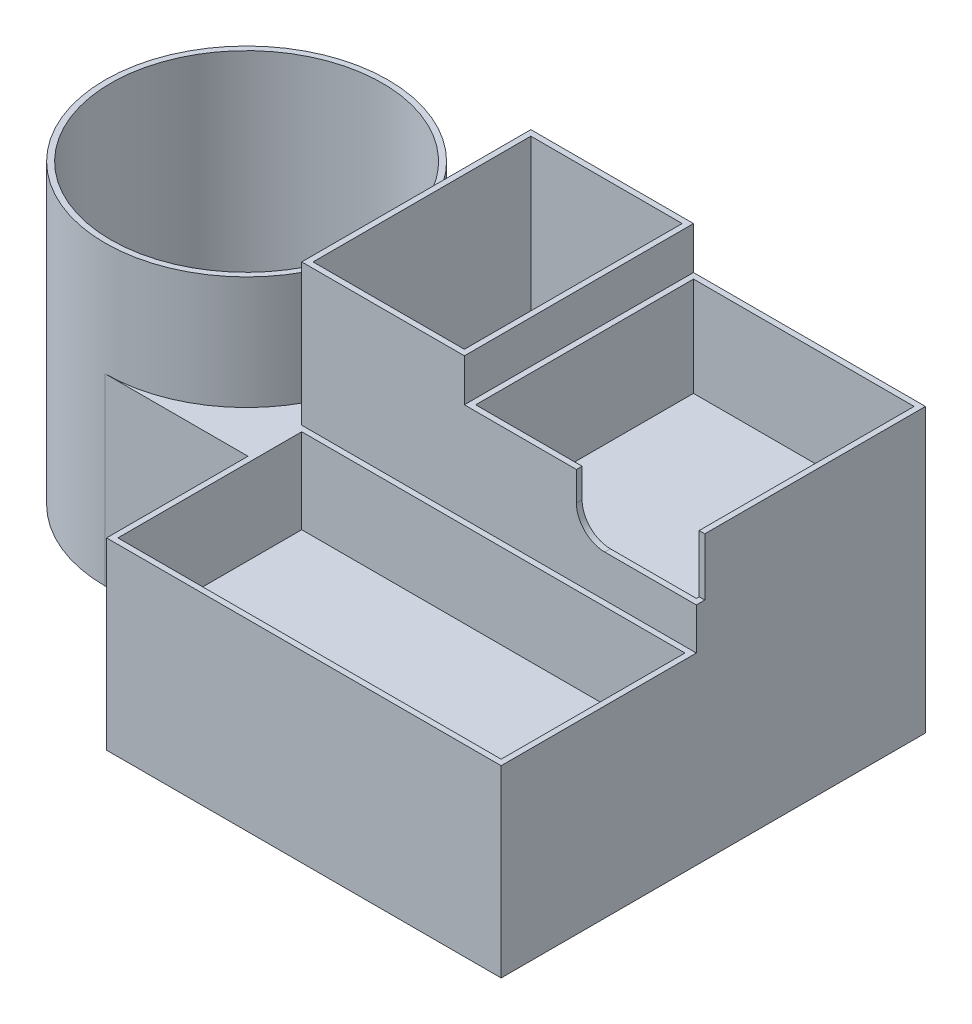
ISO-10303-21;
HEADER;
FILE_DESCRIPTION(('STEP AP214'),'2;1');
FILE_NAME('part.step','',(''),(''),'','','');
FILE_SCHEMA(('AUTOMOTIVE_DESIGN { 1 0 10303 214 1 1 1 1 }'));
ENDSEC;
DATA;
#1=APPLICATION_CONTEXT('core data for automotive mechanical design processes');
#2=APPLICATION_PROTOCOL_DEFINITION('international standard','automotive_design',2000,#1);
#3=PRODUCT_CONTEXT('',#1,'mechanical');
#4=PRODUCT('Part','Part','',(#3));
#5=PRODUCT_RELATED_PRODUCT_CATEGORY('part','',(#4));
#6=PRODUCT_DEFINITION_FORMATION('','',#4);
#7=PRODUCT_DEFINITION_CONTEXT('part definition',#1,'design');
#8=PRODUCT_DEFINITION('design','',#6,#7);
#9=PRODUCT_DEFINITION_SHAPE('','',#8);
#10=(LENGTH_UNIT() NAMED_UNIT(*) SI_UNIT(.MILLI.,.METRE.));
#11=(NAMED_UNIT(*) PLANE_ANGLE_UNIT() SI_UNIT($,.RADIAN.));
#12=(NAMED_UNIT(*) SI_UNIT($,.STERADIAN.) SOLID_ANGLE_UNIT());
#13=UNCERTAINTY_MEASURE_WITH_UNIT(LENGTH_MEASURE(1.E-05),#10,'distance_accuracy_value','');
#14=(GEOMETRIC_REPRESENTATION_CONTEXT(3) GLOBAL_UNCERTAINTY_ASSIGNED_CONTEXT((#13)) GLOBAL_UNIT_ASSIGNED_CONTEXT((#10,
#11,#12)) REPRESENTATION_CONTEXT('',''));
#15=CARTESIAN_POINT('',(0.,0.,0.));
#16=DIRECTION('',(0.,0.,1.));
#17=DIRECTION('',(1.,0.,0.));
#18=AXIS2_PLACEMENT_3D('',#15,#16,#17);
#19=CARTESIAN_POINT('',(-71.,65.,-1.));
#20=DIRECTION('',(0.,1.,0.));
#21=DIRECTION('',(0.,0.,1.));
#22=AXIS2_PLACEMENT_3D('',#19,#20,#21);
#23=PLANE('',#22);
#24=DIRECTION('',(0.,0.,1.));
#25=VECTOR('',#24,1.);
#26=CARTESIAN_POINT('',(-17.5,65.,98.));
#27=LINE('',#26,#25);
#28=CARTESIAN_POINT('',(-17.5,65.,33.));
#29=VERTEX_POINT('',#28);
#30=CARTESIAN_POINT('',(-17.5,65.,98.));
#31=VERTEX_POINT('',#30);
#32=EDGE_CURVE('E53',#29,#31,#27,.T.);
#33=ORIENTED_EDGE('',*,*,#32,.F.);
#34=DIRECTION('',(-1.,0.,0.));
#35=VECTOR('',#34,1.);
#36=CARTESIAN_POINT('',(-17.5,65.,33.));
#37=LINE('',#36,#35);
#38=CARTESIAN_POINT('',(118.,65.,33.));
#39=VERTEX_POINT('',#38);
#40=EDGE_CURVE('E258',#39,#29,#37,.T.);
#41=ORIENTED_EDGE('',*,*,#40,.F.);
#42=DIRECTION('',(0.,0.,-1.));
#43=VECTOR('',#42,1.);
#44=CARTESIAN_POINT('',(118.,65.,98.));
#45=LINE('',#44,#43);
#46=CARTESIAN_POINT('',(118.,65.,98.));
#47=VERTEX_POINT('',#46);
#48=EDGE_CURVE('E261',#47,#39,#45,.T.);
#49=ORIENTED_EDGE('',*,*,#48,.F.);
#50=DIRECTION('',(1.,0.,0.));
#51=VECTOR('',#50,1.);
#52=CARTESIAN_POINT('',(-17.5,65.,98.));
#53=LINE('',#52,#51);
#54=EDGE_CURVE('E267',#31,#47,#53,.T.);
#55=ORIENTED_EDGE('',*,*,#54,.F.);
#56=EDGE_LOOP('',(#33,#41,#49,#55));
#57=FACE_BOUND('',#56,.T.);
#58=DIRECTION('',(1.,0.,0.));
#59=VECTOR('',#58,1.);
#60=CARTESIAN_POINT('',(-69.9999999999997,65.,50.));
#61=LINE('',#60,#59);
#62=CARTESIAN_POINT('',(-69.9999999999997,65.,50.));
#63=VERTEX_POINT('',#62);
#64=CARTESIAN_POINT('',(-19.5,65.,50.));
#65=VERTEX_POINT('',#64);
#66=EDGE_CURVE('E445',#63,#65,#61,.T.);
#67=ORIENTED_EDGE('',*,*,#66,.T.);
#68=DIRECTION('',(0.,0.,1.));
#69=VECTOR('',#68,1.);
#70=CARTESIAN_POINT('',(-19.5,65.,50.));
#71=LINE('',#70,#69);
#72=CARTESIAN_POINT('',(-19.5,65.,100.));
#73=VERTEX_POINT('',#72);
#74=EDGE_CURVE('E273',#65,#73,#71,.T.);
#75=ORIENTED_EDGE('',*,*,#74,.T.);
#76=DIRECTION('',(1.,0.,0.));
#77=VECTOR('',#76,1.);
#78=CARTESIAN_POINT('',(-19.5,65.,100.));
#79=LINE('',#78,#77);
#80=CARTESIAN_POINT('',(120.,65.,100.));
#81=VERTEX_POINT('',#80);
#82=EDGE_CURVE('E279',#73,#81,#79,.T.);
#83=ORIENTED_EDGE('',*,*,#82,.T.);
#84=DIRECTION('',(0.,0.,-1.));
#85=VECTOR('',#84,1.);
#86=CARTESIAN_POINT('',(120.,65.,50.));
#87=LINE('',#86,#85);
#88=CARTESIAN_POINT('',(120.,65.,31.));
#89=VERTEX_POINT('',#88);
#90=EDGE_CURVE('E434',#81,#89,#87,.T.);
#91=ORIENTED_EDGE('',*,*,#90,.T.);
#92=DIRECTION('',(1.,0.,0.));
#93=VECTOR('',#92,1.);
#94=CARTESIAN_POINT('',(-71.,65.,31.));
#95=LINE('',#94,#93);
#96=CARTESIAN_POINT('',(-19.5,65.,31.));
#97=VERTEX_POINT('',#96);
#98=EDGE_CURVE('E475',#97,#89,#95,.T.);
#99=ORIENTED_EDGE('',*,*,#98,.F.);
#100=DIRECTION('',(0.,0.,-1.));
#101=VECTOR('',#100,1.);
#102=CARTESIAN_POINT('',(-19.5,65.,-1.00000000000001));
#103=LINE('',#102,#101);
#104=CARTESIAN_POINT('',(-19.5,65.,-50.));
#105=VERTEX_POINT('',#104);
#106=EDGE_CURVE('E478',#97,#105,#103,.T.);
#107=ORIENTED_EDGE('',*,*,#106,.T.);
#108=DIRECTION('',(-1.,0.,0.));
#109=VECTOR('',#108,1.);
#110=CARTESIAN_POINT('',(-70.9999999999997,65.,-50.));
#111=LINE('',#110,#109);
#112=CARTESIAN_POINT('',(-70.,65.,-50.));
#113=VERTEX_POINT('',#112);
#114=EDGE_CURVE('E438',#105,#113,#111,.T.);
#115=ORIENTED_EDGE('',*,*,#114,.T.);
#116=CARTESIAN_POINT('',(-70.,65.,0.));
#117=DIRECTION('',(0.,1.,0.));
#118=DIRECTION('',(0.,0.,1.));
#119=AXIS2_PLACEMENT_3D('',#116,#117,#118);
#120=CIRCLE('',#119,50.);
#121=EDGE_CURVE('E472',#113,#63,#120,.F.);
#122=ORIENTED_EDGE('',*,*,#121,.T.);
#123=EDGE_LOOP('',(#67,#75,#83,#91,#99,#107,#115,#122));
#124=FACE_BOUND('',#123,.T.);
#125=ADVANCED_FACE('F38',(#57,#124),#23,.T.);
#126=DIRECTION('',(0.,0.,1.));
#127=VECTOR('',#126,1.);
#128=CARTESIAN_POINT('',(-120.,65.,-3.53883589099269E-13));
#129=LINE('',#128,#127);
#130=CARTESIAN_POINT('',(-120.,65.,-0.999999999999662));
#131=VERTEX_POINT('',#130);
#132=CARTESIAN_POINT('',(-120.,65.,0.));
#133=VERTEX_POINT('',#132);
#134=EDGE_CURVE('E442',#131,#133,#129,.T.);
#135=ORIENTED_EDGE('',*,*,#134,.T.);
#136=EDGE_CURVE('E474',#133,#113,#120,.F.);
#137=ORIENTED_EDGE('',*,*,#136,.T.);
#138=CARTESIAN_POINT('',(-70.9999999999997,65.,-50.));
#139=VERTEX_POINT('',#138);
#140=EDGE_CURVE('E436',#113,#139,#111,.T.);
#141=ORIENTED_EDGE('',*,*,#140,.T.);
#142=CARTESIAN_POINT('',(-71.,65.,-1.));
#143=DIRECTION('',(0.,1.,0.));
#144=DIRECTION('',(0.,0.,1.));
#145=AXIS2_PLACEMENT_3D('',#142,#143,#144);
#146=CIRCLE('',#145,49.);
#147=EDGE_CURVE('E440',#139,#131,#146,.T.);
#148=ORIENTED_EDGE('',*,*,#147,.T.);
#149=EDGE_LOOP('',(#135,#137,#141,#148));
#150=FACE_BOUND('',#149,.T.);
#151=ADVANCED_FACE('F564',(#150),#23,.T.);
#152=CARTESIAN_POINT('',(120.,65.,50.));
#153=DIRECTION('',(-1.,0.,0.));
#154=DIRECTION('',(0.,0.,1.));
#155=AXIS2_PLACEMENT_3D('',#152,#153,#154);
#156=PLANE('',#155);
#157=DIRECTION('',(0.,0.,-1.));
#158=VECTOR('',#157,1.);
#159=CARTESIAN_POINT('',(120.,0.,50.));
#160=LINE('',#159,#158);
#161=CARTESIAN_POINT('',(120.,0.,100.));
#162=VERTEX_POINT('',#161);
#163=CARTESIAN_POINT('',(120.,0.,-50.));
#164=VERTEX_POINT('',#163);
#165=EDGE_CURVE('E433',#162,#164,#160,.T.);
#166=ORIENTED_EDGE('',*,*,#165,.T.);
#167=DIRECTION('',(0.,-1.,0.));
#168=VECTOR('',#167,1.);
#169=CARTESIAN_POINT('',(120.,65.,-50.));
#170=LINE('',#169,#168);
#171=CARTESIAN_POINT('',(120.,100.,-50.));
#172=VERTEX_POINT('',#171);
#173=EDGE_CURVE('E469',#172,#164,#170,.T.);
#174=ORIENTED_EDGE('',*,*,#173,.F.);
#175=DIRECTION('',(0.,0.,-1.));
#176=VECTOR('',#175,1.);
#177=CARTESIAN_POINT('',(120.,100.,0.));
#178=LINE('',#177,#176);
#179=CARTESIAN_POINT('',(120.,100.,28.));
#180=VERTEX_POINT('',#179);
#181=EDGE_CURVE('E333',#180,#172,#178,.T.);
#182=ORIENTED_EDGE('',*,*,#181,.F.);
#183=DIRECTION('',(0.,1.,0.));
#184=VECTOR('',#183,1.);
#185=CARTESIAN_POINT('',(120.,100.,28.));
#186=LINE('',#185,#184);
#187=CARTESIAN_POINT('',(120.,79.725450473205,28.));
#188=VERTEX_POINT('',#187);
#189=EDGE_CURVE('E300',#188,#180,#186,.T.);
#190=ORIENTED_EDGE('',*,*,#189,.F.);
#191=DIRECTION('',(0.,0.,1.));
#192=VECTOR('',#191,1.);
#193=CARTESIAN_POINT('',(120.,79.725450473205,28.));
#194=LINE('',#193,#192);
#195=CARTESIAN_POINT('',(120.,79.725450473205,31.));
#196=VERTEX_POINT('',#195);
#197=EDGE_CURVE('E309',#188,#196,#194,.T.);
#198=ORIENTED_EDGE('',*,*,#197,.T.);
#199=DIRECTION('',(0.,-1.,0.));
#200=VECTOR('',#199,1.);
#201=CARTESIAN_POINT('',(120.,100.,31.));
#202=LINE('',#201,#200);
#203=EDGE_CURVE('E347',#196,#89,#202,.T.);
#204=ORIENTED_EDGE('',*,*,#203,.T.);
#205=ORIENTED_EDGE('',*,*,#90,.F.);
#206=DIRECTION('',(0.,1.,0.));
#207=VECTOR('',#206,1.);
#208=CARTESIAN_POINT('',(120.,0.,100.));
#209=LINE('',#208,#207);
#210=EDGE_CURVE('E288',#162,#81,#209,.T.);
#211=ORIENTED_EDGE('',*,*,#210,.F.);
#212=EDGE_LOOP('',(#166,#174,#182,#190,#198,#204,#205,#211));
#213=FACE_BOUND('',#212,.T.);
#214=ADVANCED_FACE('F40',(#213),#156,.F.);
#215=CARTESIAN_POINT('',(-70.9999999999997,65.,-50.));
#216=DIRECTION('',(0.,0.,1.));
#217=DIRECTION('',(1.,0.,0.));
#218=AXIS2_PLACEMENT_3D('',#215,#216,#217);
#219=PLANE('',#218);
#220=ORIENTED_EDGE('',*,*,#114,.F.);
#221=DIRECTION('',(0.,-1.,0.));
#222=VECTOR('',#221,1.);
#223=CARTESIAN_POINT('',(-19.5,115.,-50.));
#224=LINE('',#223,#222);
#225=CARTESIAN_POINT('',(-19.5,115.,-50.));
#226=VERTEX_POINT('',#225);
#227=EDGE_CURVE('E408',#226,#105,#224,.T.);
#228=ORIENTED_EDGE('',*,*,#227,.F.);
#229=DIRECTION('',(-1.,0.,0.));
#230=VECTOR('',#229,1.);
#231=CARTESIAN_POINT('',(0.,115.,-50.));
#232=LINE('',#231,#230);
#233=CARTESIAN_POINT('',(38.,115.,-50.));
#234=VERTEX_POINT('',#233);
#235=EDGE_CURVE('E382',#234,#226,#232,.T.);
#236=ORIENTED_EDGE('',*,*,#235,.F.);
#237=DIRECTION('',(0.,-1.,0.));
#238=VECTOR('',#237,1.);
#239=CARTESIAN_POINT('',(38.,115.,-50.));
#240=LINE('',#239,#238);
#241=CARTESIAN_POINT('',(38.,100.,-50.));
#242=VERTEX_POINT('',#241);
#243=EDGE_CURVE('E404',#234,#242,#240,.T.);
#244=ORIENTED_EDGE('',*,*,#243,.T.);
#245=DIRECTION('',(-1.,0.,0.));
#246=VECTOR('',#245,1.);
#247=CARTESIAN_POINT('',(0.,100.,-50.));
#248=LINE('',#247,#246);
#249=EDGE_CURVE('E324',#172,#242,#248,.T.);
#250=ORIENTED_EDGE('',*,*,#249,.F.);
#251=ORIENTED_EDGE('',*,*,#173,.T.);
#252=DIRECTION('',(-1.,0.,0.));
#253=VECTOR('',#252,1.);
#254=CARTESIAN_POINT('',(-70.9999999999997,0.,-50.));
#255=LINE('',#254,#253);
#256=CARTESIAN_POINT('',(-70.9999999999997,0.,-50.));
#257=VERTEX_POINT('',#256);
#258=EDGE_CURVE('E449',#164,#257,#255,.T.);
#259=ORIENTED_EDGE('',*,*,#258,.T.);
#260=DIRECTION('',(0.,-1.,0.));
#261=VECTOR('',#260,1.);
#262=CARTESIAN_POINT('',(-70.9999999999997,65.,-50.));
#263=LINE('',#262,#261);
#264=EDGE_CURVE('E466',#139,#257,#263,.T.);
#265=ORIENTED_EDGE('',*,*,#264,.F.);
#266=ORIENTED_EDGE('',*,*,#140,.F.);
#267=EDGE_LOOP('',(#220,#228,#236,#244,#250,#251,#259,#265,#266));
#268=FACE_BOUND('',#267,.T.);
#269=ADVANCED_FACE('F527',(#268),#219,.F.);
#270=CARTESIAN_POINT('',(-71.,65.,-1.));
#271=DIRECTION('',(0.,-1.,0.));
#272=DIRECTION('',(0.,0.,-1.));
#273=AXIS2_PLACEMENT_3D('',#270,#271,#272);
#274=CYLINDRICAL_SURFACE('',#273,49.);
#275=CARTESIAN_POINT('',(-71.,0.,-1.));
#276=DIRECTION('',(0.,1.,0.));
#277=DIRECTION('',(0.,0.,1.));
#278=AXIS2_PLACEMENT_3D('',#275,#276,#277);
#279=CIRCLE('',#278,49.);
#280=CARTESIAN_POINT('',(-120.,0.,-0.999999999999662));
#281=VERTEX_POINT('',#280);
#282=EDGE_CURVE('E451',#257,#281,#279,.T.);
#283=ORIENTED_EDGE('',*,*,#282,.T.);
#284=DIRECTION('',(0.,-1.,0.));
#285=VECTOR('',#284,1.);
#286=CARTESIAN_POINT('',(-120.,65.,-0.999999999999662));
#287=LINE('',#286,#285);
#288=EDGE_CURVE('E463',#131,#281,#287,.T.);
#289=ORIENTED_EDGE('',*,*,#288,.F.);
#290=ORIENTED_EDGE('',*,*,#147,.F.);
#291=ORIENTED_EDGE('',*,*,#264,.T.);
#292=EDGE_LOOP('',(#283,#289,#290,#291));
#293=FACE_BOUND('',#292,.T.);
#294=ADVANCED_FACE('F560',(#293),#274,.T.);
#295=CARTESIAN_POINT('',(-120.,65.,-3.53883589099269E-13));
#296=DIRECTION('',(1.,0.,0.));
#297=DIRECTION('',(0.,0.,-1.));
#298=AXIS2_PLACEMENT_3D('',#295,#296,#297);
#299=PLANE('',#298);
#300=DIRECTION('',(0.,0.,1.));
#301=VECTOR('',#300,1.);
#302=CARTESIAN_POINT('',(-120.,0.,-3.53883589099269E-13));
#303=LINE('',#302,#301);
#304=CARTESIAN_POINT('',(-120.,0.,-3.53883589099269E-13));
#305=VERTEX_POINT('',#304);
#306=EDGE_CURVE('E453',#281,#305,#303,.T.);
#307=ORIENTED_EDGE('',*,*,#306,.T.);
#308=DIRECTION('',(0.,-1.,0.));
#309=VECTOR('',#308,1.);
#310=CARTESIAN_POINT('',(-120.,65.,-3.53883589099269E-13));
#311=LINE('',#310,#309);
#312=EDGE_CURVE('E461',#133,#305,#311,.T.);
#313=ORIENTED_EDGE('',*,*,#312,.F.);
#314=ORIENTED_EDGE('',*,*,#134,.F.);
#315=ORIENTED_EDGE('',*,*,#288,.T.);
#316=EDGE_LOOP('',(#307,#313,#314,#315));
#317=FACE_BOUND('',#316,.T.);
#318=ADVANCED_FACE('F667',(#317),#299,.F.);
#319=CARTESIAN_POINT('',(-70.,65.,0.));
#320=DIRECTION('',(0.,-1.,0.));
#321=DIRECTION('',(0.,0.,-1.));
#322=AXIS2_PLACEMENT_3D('',#319,#320,#321);
#323=CYLINDRICAL_SURFACE('',#322,50.);
#324=ORIENTED_EDGE('',*,*,#312,.T.);
#325=CARTESIAN_POINT('',(-70.,0.,0.));
#326=DIRECTION('',(0.,1.,0.));
#327=DIRECTION('',(0.,0.,-1.));
#328=AXIS2_PLACEMENT_3D('',#325,#326,#327);
#329=CIRCLE('',#328,50.);
#330=CARTESIAN_POINT('',(-69.9999999999997,0.,50.));
#331=VERTEX_POINT('',#330);
#332=EDGE_CURVE('E456',#305,#331,#329,.T.);
#333=ORIENTED_EDGE('',*,*,#332,.T.);
#334=DIRECTION('',(0.,-1.,0.));
#335=VECTOR('',#334,1.);
#336=CARTESIAN_POINT('',(-69.9999999999997,65.,50.));
#337=LINE('',#336,#335);
#338=EDGE_CURVE('E447',#63,#331,#337,.T.);
#339=ORIENTED_EDGE('',*,*,#338,.F.);
#340=ORIENTED_EDGE('',*,*,#121,.F.);
#341=ORIENTED_EDGE('',*,*,#136,.F.);
#342=EDGE_LOOP('',(#324,#333,#339,#340,#341));
#343=FACE_BOUND('',#342,.T.);
#344=CARTESIAN_POINT('',(-70.,105.,0.));
#345=DIRECTION('',(0.,1.,0.));
#346=DIRECTION('',(0.,0.,1.));
#347=AXIS2_PLACEMENT_3D('',#344,#345,#346);
#348=CIRCLE('',#347,50.);
#349=CARTESIAN_POINT('',(-70.,105.,50.));
#350=VERTEX_POINT('',#349);
#351=EDGE_CURVE('E430',#350,#350,#348,.T.);
#352=ORIENTED_EDGE('',*,*,#351,.F.);
#353=EDGE_LOOP('',(#352));
#354=FACE_BOUND('',#353,.T.);
#355=ADVANCED_FACE('F570',(#343,#354),#323,.T.);
#356=CARTESIAN_POINT('',(-69.9999999999997,65.,50.));
#357=DIRECTION('',(0.,0.,-1.));
#358=DIRECTION('',(-1.,0.,0.));
#359=AXIS2_PLACEMENT_3D('',#356,#357,#358);
#360=PLANE('',#359);
#361=DIRECTION('',(0.,1.,0.));
#362=VECTOR('',#361,1.);
#363=CARTESIAN_POINT('',(-19.5,0.,50.));
#364=LINE('',#363,#362);
#365=CARTESIAN_POINT('',(-19.5,0.,50.));
#366=VERTEX_POINT('',#365);
#367=EDGE_CURVE('E61',#366,#65,#364,.T.);
#368=ORIENTED_EDGE('',*,*,#367,.T.);
#369=ORIENTED_EDGE('',*,*,#66,.F.);
#370=ORIENTED_EDGE('',*,*,#338,.T.);
#371=DIRECTION('',(1.,0.,0.));
#372=VECTOR('',#371,1.);
#373=CARTESIAN_POINT('',(-69.9999999999997,0.,50.));
#374=LINE('',#373,#372);
#375=EDGE_CURVE('E437',#331,#366,#374,.T.);
#376=ORIENTED_EDGE('',*,*,#375,.T.);
#377=EDGE_LOOP('',(#368,#369,#370,#376));
#378=FACE_BOUND('',#377,.T.);
#379=ADVANCED_FACE('F573',(#378),#360,.F.);
#380=CARTESIAN_POINT('',(-71.,0.,-1.));
#381=DIRECTION('',(0.,1.,0.));
#382=DIRECTION('',(0.,0.,1.));
#383=AXIS2_PLACEMENT_3D('',#380,#381,#382);
#384=PLANE('',#383);
#385=ORIENTED_EDGE('',*,*,#258,.F.);
#386=ORIENTED_EDGE('',*,*,#165,.F.);
#387=DIRECTION('',(1.,0.,0.));
#388=VECTOR('',#387,1.);
#389=CARTESIAN_POINT('',(120.,0.,100.));
#390=LINE('',#389,#388);
#391=CARTESIAN_POINT('',(-19.5,0.,100.));
#392=VERTEX_POINT('',#391);
#393=EDGE_CURVE('E285',#392,#162,#390,.T.);
#394=ORIENTED_EDGE('',*,*,#393,.F.);
#395=DIRECTION('',(0.,0.,1.));
#396=VECTOR('',#395,1.);
#397=CARTESIAN_POINT('',(-19.5,0.,50.));
#398=LINE('',#397,#396);
#399=EDGE_CURVE('E282',#366,#392,#398,.T.);
#400=ORIENTED_EDGE('',*,*,#399,.F.);
#401=ORIENTED_EDGE('',*,*,#375,.F.);
#402=ORIENTED_EDGE('',*,*,#332,.F.);
#403=ORIENTED_EDGE('',*,*,#306,.F.);
#404=ORIENTED_EDGE('',*,*,#282,.F.);
#405=EDGE_LOOP('',(#385,#386,#394,#400,#401,#402,#403,#404));
#406=FACE_BOUND('',#405,.T.);
#407=ADVANCED_FACE('F552',(#406),#384,.F.);
#408=CARTESIAN_POINT('',(-70.,105.,0.));
#409=DIRECTION('',(0.,-1.,0.));
#410=DIRECTION('',(0.,0.,-1.));
#411=AXIS2_PLACEMENT_3D('',#408,#409,#410);
#412=CYLINDRICAL_SURFACE('',#411,48.);
#413=CARTESIAN_POINT('',(-70.,105.,0.));
#414=DIRECTION('',(0.,1.,0.));
#415=DIRECTION('',(0.,0.,1.));
#416=AXIS2_PLACEMENT_3D('',#413,#414,#415);
#417=CIRCLE('',#416,48.);
#418=CARTESIAN_POINT('',(-70.,105.,48.));
#419=VERTEX_POINT('',#418);
#420=EDGE_CURVE('E427',#419,#419,#417,.T.);
#421=ORIENTED_EDGE('',*,*,#420,.T.);
#422=EDGE_LOOP('',(#421));
#423=FACE_BOUND('',#422,.T.);
#424=CARTESIAN_POINT('',(-70.,15.,0.));
#425=DIRECTION('',(0.,1.,0.));
#426=DIRECTION('',(0.,0.,1.));
#427=AXIS2_PLACEMENT_3D('',#424,#425,#426);
#428=CIRCLE('',#427,48.);
#429=CARTESIAN_POINT('',(-70.,15.,48.));
#430=VERTEX_POINT('',#429);
#431=EDGE_CURVE('E414',#430,#430,#428,.T.);
#432=ORIENTED_EDGE('',*,*,#431,.F.);
#433=EDGE_LOOP('',(#432));
#434=FACE_BOUND('',#433,.T.);
#435=ADVANCED_FACE('F654',(#423,#434),#412,.F.);
#436=CARTESIAN_POINT('',(0.,105.,0.));
#437=DIRECTION('',(0.,1.,0.));
#438=DIRECTION('',(0.,0.,1.));
#439=AXIS2_PLACEMENT_3D('',#436,#437,#438);
#440=PLANE('',#439);
#441=ORIENTED_EDGE('',*,*,#420,.F.);
#442=EDGE_LOOP('',(#441));
#443=FACE_BOUND('',#442,.T.);
#444=ORIENTED_EDGE('',*,*,#351,.T.);
#445=EDGE_LOOP('',(#444));
#446=FACE_BOUND('',#445,.T.);
#447=ADVANCED_FACE('F651',(#443,#446),#440,.T.);
#448=CARTESIAN_POINT('',(0.,15.,0.));
#449=DIRECTION('',(0.,1.,0.));
#450=DIRECTION('',(0.,0.,1.));
#451=AXIS2_PLACEMENT_3D('',#448,#449,#450);
#452=PLANE('',#451);
#453=ORIENTED_EDGE('',*,*,#431,.T.);
#454=EDGE_LOOP('',(#453));
#455=FACE_BOUND('',#454,.T.);
#456=ADVANCED_FACE('F641',(#455),#452,.T.);
#457=CARTESIAN_POINT('',(0.,115.,-48.));
#458=DIRECTION('',(0.,0.,-1.));
#459=DIRECTION('',(-1.,0.,0.));
#460=AXIS2_PLACEMENT_3D('',#457,#458,#459);
#461=PLANE('',#460);
#462=DIRECTION('',(0.,-1.,0.));
#463=VECTOR('',#462,1.);
#464=CARTESIAN_POINT('',(-17.5,115.,-48.));
#465=LINE('',#464,#463);
#466=CARTESIAN_POINT('',(-17.5,115.,-48.));
#467=VERTEX_POINT('',#466);
#468=CARTESIAN_POINT('',(-17.5,15.,-48.));
#469=VERTEX_POINT('',#468);
#470=EDGE_CURVE('E405',#467,#469,#465,.T.);
#471=ORIENTED_EDGE('',*,*,#470,.T.);
#472=DIRECTION('',(1.,0.,0.));
#473=VECTOR('',#472,1.);
#474=CARTESIAN_POINT('',(0.,15.,-48.));
#475=LINE('',#474,#473);
#476=CARTESIAN_POINT('',(36.,15.,-48.));
#477=VERTEX_POINT('',#476);
#478=EDGE_CURVE('E373',#469,#477,#475,.T.);
#479=ORIENTED_EDGE('',*,*,#478,.T.);
#480=DIRECTION('',(0.,-1.,0.));
#481=VECTOR('',#480,1.);
#482=CARTESIAN_POINT('',(36.,115.,-48.));
#483=LINE('',#482,#481);
#484=CARTESIAN_POINT('',(36.,115.,-48.));
#485=VERTEX_POINT('',#484);
#486=EDGE_CURVE('E412',#485,#477,#483,.T.);
#487=ORIENTED_EDGE('',*,*,#486,.F.);
#488=DIRECTION('',(1.,0.,0.));
#489=VECTOR('',#488,1.);
#490=CARTESIAN_POINT('',(0.,115.,-48.));
#491=LINE('',#490,#489);
#492=EDGE_CURVE('E393',#467,#485,#491,.T.);
#493=ORIENTED_EDGE('',*,*,#492,.F.);
#494=EDGE_LOOP('',(#471,#479,#487,#493));
#495=FACE_BOUND('',#494,.T.);
#496=ADVANCED_FACE('F637',(#495),#461,.F.);
#497=CARTESIAN_POINT('',(36.,115.,0.));
#498=DIRECTION('',(1.,0.,0.));
#499=DIRECTION('',(0.,0.,-1.));
#500=AXIS2_PLACEMENT_3D('',#497,#498,#499);
#501=PLANE('',#500);
#502=ORIENTED_EDGE('',*,*,#486,.T.);
#503=DIRECTION('',(0.,0.,1.));
#504=VECTOR('',#503,1.);
#505=CARTESIAN_POINT('',(36.,15.,0.));
#506=LINE('',#505,#504);
#507=CARTESIAN_POINT('',(36.,15.,29.));
#508=VERTEX_POINT('',#507);
#509=EDGE_CURVE('E368',#477,#508,#506,.T.);
#510=ORIENTED_EDGE('',*,*,#509,.T.);
#511=DIRECTION('',(0.,-1.,0.));
#512=VECTOR('',#511,1.);
#513=CARTESIAN_POINT('',(36.,115.,29.));
#514=LINE('',#513,#512);
#515=CARTESIAN_POINT('',(36.,115.,29.));
#516=VERTEX_POINT('',#515);
#517=EDGE_CURVE('E410',#516,#508,#514,.T.);
#518=ORIENTED_EDGE('',*,*,#517,.F.);
#519=DIRECTION('',(0.,0.,1.));
#520=VECTOR('',#519,1.);
#521=CARTESIAN_POINT('',(36.,115.,0.));
#522=LINE('',#521,#520);
#523=EDGE_CURVE('E396',#485,#516,#522,.T.);
#524=ORIENTED_EDGE('',*,*,#523,.F.);
#525=EDGE_LOOP('',(#502,#510,#518,#524));
#526=FACE_BOUND('',#525,.T.);
#527=ADVANCED_FACE('F633',(#526),#501,.F.);
#528=CARTESIAN_POINT('',(0.,115.,29.));
#529=DIRECTION('',(0.,0.,-1.));
#530=DIRECTION('',(-1.,0.,0.));
#531=AXIS2_PLACEMENT_3D('',#528,#529,#530);
#532=PLANE('',#531);
#533=ORIENTED_EDGE('',*,*,#517,.T.);
#534=DIRECTION('',(1.,0.,0.));
#535=VECTOR('',#534,1.);
#536=CARTESIAN_POINT('',(0.,15.,29.));
#537=LINE('',#536,#535);
#538=CARTESIAN_POINT('',(-17.5,15.,29.));
#539=VERTEX_POINT('',#538);
#540=EDGE_CURVE('E379',#539,#508,#537,.T.);
#541=ORIENTED_EDGE('',*,*,#540,.F.);
#542=DIRECTION('',(0.,-1.,0.));
#543=VECTOR('',#542,1.);
#544=CARTESIAN_POINT('',(-17.5,115.,29.));
#545=LINE('',#544,#543);
#546=CARTESIAN_POINT('',(-17.5,115.,29.));
#547=VERTEX_POINT('',#546);
#548=EDGE_CURVE('E407',#547,#539,#545,.T.);
#549=ORIENTED_EDGE('',*,*,#548,.F.);
#550=DIRECTION('',(1.,0.,0.));
#551=VECTOR('',#550,1.);
#552=CARTESIAN_POINT('',(0.,115.,29.));
#553=LINE('',#552,#551);
#554=EDGE_CURVE('E398',#547,#516,#553,.T.);
#555=ORIENTED_EDGE('',*,*,#554,.T.);
#556=EDGE_LOOP('',(#533,#541,#549,#555));
#557=FACE_BOUND('',#556,.T.);
#558=ADVANCED_FACE('F630',(#557),#532,.T.);
#559=CARTESIAN_POINT('',(-19.5,115.,0.));
#560=DIRECTION('',(1.,0.,0.));
#561=DIRECTION('',(0.,0.,-1.));
#562=AXIS2_PLACEMENT_3D('',#559,#560,#561);
#563=PLANE('',#562);
#564=ORIENTED_EDGE('',*,*,#106,.F.);
#565=DIRECTION('',(0.,-1.,0.));
#566=VECTOR('',#565,1.);
#567=CARTESIAN_POINT('',(-19.5,115.,31.));
#568=LINE('',#567,#566);
#569=CARTESIAN_POINT('',(-19.5,115.,31.));
#570=VERTEX_POINT('',#569);
#571=EDGE_CURVE('E420',#570,#97,#568,.T.);
#572=ORIENTED_EDGE('',*,*,#571,.F.);
#573=DIRECTION('',(0.,0.,1.));
#574=VECTOR('',#573,1.);
#575=CARTESIAN_POINT('',(-19.5,115.,0.));
#576=LINE('',#575,#574);
#577=EDGE_CURVE('E385',#226,#570,#576,.T.);
#578=ORIENTED_EDGE('',*,*,#577,.F.);
#579=ORIENTED_EDGE('',*,*,#227,.T.);
#580=EDGE_LOOP('',(#564,#572,#578,#579));
#581=FACE_BOUND('',#580,.T.);
#582=ADVANCED_FACE('F542',(#581),#563,.F.);
#583=CARTESIAN_POINT('',(0.,115.,31.));
#584=DIRECTION('',(0.,0.,1.));
#585=DIRECTION('',(1.,0.,0.));
#586=AXIS2_PLACEMENT_3D('',#583,#584,#585);
#587=PLANE('',#586);
#588=DIRECTION('',(1.,0.,0.));
#589=VECTOR('',#588,1.);
#590=CARTESIAN_POINT('',(87.6114867978494,79.725450473205,31.));
#591=LINE('',#590,#589);
#592=CARTESIAN_POINT('',(87.6114867978494,79.725450473205,31.));
#593=VERTEX_POINT('',#592);
#594=EDGE_CURVE('E298',#593,#196,#591,.T.);
#595=ORIENTED_EDGE('',*,*,#594,.F.);
#596=CARTESIAN_POINT('',(87.6114867978493,89.725450473205,31.));
#597=DIRECTION('',(0.,0.,1.));
#598=DIRECTION('',(-1.,0.,0.));
#599=AXIS2_PLACEMENT_3D('',#596,#597,#598);
#600=CIRCLE('',#599,9.99999999999999);
#601=CARTESIAN_POINT('',(77.6114867978494,89.7254504732051,31.));
#602=VERTEX_POINT('',#601);
#603=EDGE_CURVE('E305',#602,#593,#600,.T.);
#604=ORIENTED_EDGE('',*,*,#603,.F.);
#605=DIRECTION('',(0.,-1.,0.));
#606=VECTOR('',#605,1.);
#607=CARTESIAN_POINT('',(77.6114867978494,100.,31.));
#608=LINE('',#607,#606);
#609=CARTESIAN_POINT('',(77.6114867978494,100.,31.));
#610=VERTEX_POINT('',#609);
#611=EDGE_CURVE('E291',#610,#602,#608,.T.);
#612=ORIENTED_EDGE('',*,*,#611,.F.);
#613=DIRECTION('',(-1.,0.,0.));
#614=VECTOR('',#613,1.);
#615=CARTESIAN_POINT('',(0.,100.,31.));
#616=LINE('',#615,#614);
#617=CARTESIAN_POINT('',(38.,100.,31.));
#618=VERTEX_POINT('',#617);
#619=EDGE_CURVE('E331',#610,#618,#616,.T.);
#620=ORIENTED_EDGE('',*,*,#619,.T.);
#621=DIRECTION('',(0.,-1.,0.));
#622=VECTOR('',#621,1.);
#623=CARTESIAN_POINT('',(38.,115.,31.));
#624=LINE('',#623,#622);
#625=CARTESIAN_POINT('',(38.,115.,31.));
#626=VERTEX_POINT('',#625);
#627=EDGE_CURVE('E417',#626,#618,#624,.T.);
#628=ORIENTED_EDGE('',*,*,#627,.F.);
#629=DIRECTION('',(-1.,0.,0.));
#630=VECTOR('',#629,1.);
#631=CARTESIAN_POINT('',(0.,115.,31.));
#632=LINE('',#631,#630);
#633=EDGE_CURVE('E387',#626,#570,#632,.T.);
#634=ORIENTED_EDGE('',*,*,#633,.T.);
#635=ORIENTED_EDGE('',*,*,#571,.T.);
#636=ORIENTED_EDGE('',*,*,#98,.T.);
#637=ORIENTED_EDGE('',*,*,#203,.F.);
#638=EDGE_LOOP('',(#595,#604,#612,#620,#628,#634,#635,#636,#637));
#639=FACE_BOUND('',#638,.T.);
#640=ADVANCED_FACE('F535',(#639),#587,.T.);
#641=CARTESIAN_POINT('',(38.,115.,0.));
#642=DIRECTION('',(1.,0.,0.));
#643=DIRECTION('',(0.,0.,-1.));
#644=AXIS2_PLACEMENT_3D('',#641,#642,#643);
#645=PLANE('',#644);
#646=DIRECTION('',(0.,0.,1.));
#647=VECTOR('',#646,1.);
#648=CARTESIAN_POINT('',(38.,100.,0.));
#649=LINE('',#648,#647);
#650=EDGE_CURVE('E327',#242,#618,#649,.T.);
#651=ORIENTED_EDGE('',*,*,#650,.F.);
#652=ORIENTED_EDGE('',*,*,#243,.F.);
#653=DIRECTION('',(0.,0.,1.));
#654=VECTOR('',#653,1.);
#655=CARTESIAN_POINT('',(38.,115.,0.));
#656=LINE('',#655,#654);
#657=EDGE_CURVE('E390',#234,#626,#656,.T.);
#658=ORIENTED_EDGE('',*,*,#657,.T.);
#659=ORIENTED_EDGE('',*,*,#627,.T.);
#660=EDGE_LOOP('',(#651,#652,#658,#659));
#661=FACE_BOUND('',#660,.T.);
#662=ADVANCED_FACE('F532',(#661),#645,.T.);
#663=CARTESIAN_POINT('',(-17.5,115.,0.));
#664=DIRECTION('',(1.,0.,0.));
#665=DIRECTION('',(0.,0.,-1.));
#666=AXIS2_PLACEMENT_3D('',#663,#664,#665);
#667=PLANE('',#666);
#668=ORIENTED_EDGE('',*,*,#548,.T.);
#669=DIRECTION('',(0.,0.,1.));
#670=VECTOR('',#669,1.);
#671=CARTESIAN_POINT('',(-17.5,15.,0.));
#672=LINE('',#671,#670);
#673=EDGE_CURVE('E376',#469,#539,#672,.T.);
#674=ORIENTED_EDGE('',*,*,#673,.F.);
#675=ORIENTED_EDGE('',*,*,#470,.F.);
#676=DIRECTION('',(0.,0.,1.));
#677=VECTOR('',#676,1.);
#678=CARTESIAN_POINT('',(-17.5,115.,0.));
#679=LINE('',#678,#677);
#680=EDGE_CURVE('E401',#467,#547,#679,.T.);
#681=ORIENTED_EDGE('',*,*,#680,.T.);
#682=EDGE_LOOP('',(#668,#674,#675,#681));
#683=FACE_BOUND('',#682,.T.);
#684=ADVANCED_FACE('F626',(#683),#667,.T.);
#685=CARTESIAN_POINT('',(0.,115.,0.));
#686=DIRECTION('',(0.,1.,0.));
#687=DIRECTION('',(0.,0.,1.));
#688=AXIS2_PLACEMENT_3D('',#685,#686,#687);
#689=PLANE('',#688);
#690=ORIENTED_EDGE('',*,*,#235,.T.);
#691=ORIENTED_EDGE('',*,*,#577,.T.);
#692=ORIENTED_EDGE('',*,*,#633,.F.);
#693=ORIENTED_EDGE('',*,*,#657,.F.);
#694=EDGE_LOOP('',(#690,#691,#692,#693));
#695=FACE_BOUND('',#694,.T.);
#696=ORIENTED_EDGE('',*,*,#492,.T.);
#697=ORIENTED_EDGE('',*,*,#523,.T.);
#698=ORIENTED_EDGE('',*,*,#554,.F.);
#699=ORIENTED_EDGE('',*,*,#680,.F.);
#700=EDGE_LOOP('',(#696,#697,#698,#699));
#701=FACE_BOUND('',#700,.T.);
#702=ADVANCED_FACE('F537',(#695,#701),#689,.T.);
#703=CARTESIAN_POINT('',(0.,15.,0.));
#704=DIRECTION('',(0.,1.,0.));
#705=DIRECTION('',(0.,0.,1.));
#706=AXIS2_PLACEMENT_3D('',#703,#704,#705);
#707=PLANE('',#706);
#708=ORIENTED_EDGE('',*,*,#509,.F.);
#709=ORIENTED_EDGE('',*,*,#478,.F.);
#710=ORIENTED_EDGE('',*,*,#673,.T.);
#711=ORIENTED_EDGE('',*,*,#540,.T.);
#712=EDGE_LOOP('',(#708,#709,#710,#711));
#713=FACE_BOUND('',#712,.T.);
#714=ADVANCED_FACE('F620',(#713),#707,.T.);
#715=CARTESIAN_POINT('',(0.,100.,-48.));
#716=DIRECTION('',(0.,0.,-1.));
#717=DIRECTION('',(-1.,0.,0.));
#718=AXIS2_PLACEMENT_3D('',#715,#716,#717);
#719=PLANE('',#718);
#720=DIRECTION('',(1.,0.,0.));
#721=VECTOR('',#720,1.);
#722=CARTESIAN_POINT('',(0.,65.,-48.));
#723=LINE('',#722,#721);
#724=CARTESIAN_POINT('',(40.,65.,-48.));
#725=VERTEX_POINT('',#724);
#726=CARTESIAN_POINT('',(118.,65.,-48.));
#727=VERTEX_POINT('',#726);
#728=EDGE_CURVE('E323',#725,#727,#723,.T.);
#729=ORIENTED_EDGE('',*,*,#728,.T.);
#730=DIRECTION('',(0.,-1.,0.));
#731=VECTOR('',#730,1.);
#732=CARTESIAN_POINT('',(118.,100.,-48.));
#733=LINE('',#732,#731);
#734=CARTESIAN_POINT('',(118.,100.,-48.));
#735=VERTEX_POINT('',#734);
#736=EDGE_CURVE('E365',#735,#727,#733,.T.);
#737=ORIENTED_EDGE('',*,*,#736,.F.);
#738=DIRECTION('',(1.,0.,0.));
#739=VECTOR('',#738,1.);
#740=CARTESIAN_POINT('',(0.,100.,-48.));
#741=LINE('',#740,#739);
#742=CARTESIAN_POINT('',(40.,100.,-48.));
#743=VERTEX_POINT('',#742);
#744=EDGE_CURVE('E335',#743,#735,#741,.T.);
#745=ORIENTED_EDGE('',*,*,#744,.F.);
#746=DIRECTION('',(0.,-1.,0.));
#747=VECTOR('',#746,1.);
#748=CARTESIAN_POINT('',(40.,100.,-48.));
#749=LINE('',#748,#747);
#750=EDGE_CURVE('E357',#743,#725,#749,.T.);
#751=ORIENTED_EDGE('',*,*,#750,.T.);
#752=EDGE_LOOP('',(#729,#737,#745,#751));
#753=FACE_BOUND('',#752,.T.);
#754=ADVANCED_FACE('F507',(#753),#719,.F.);
#755=CARTESIAN_POINT('',(118.,100.,0.));
#756=DIRECTION('',(1.,0.,0.));
#757=DIRECTION('',(0.,0.,-1.));
#758=AXIS2_PLACEMENT_3D('',#755,#756,#757);
#759=PLANE('',#758);
#760=DIRECTION('',(0.,-1.,0.));
#761=VECTOR('',#760,1.);
#762=CARTESIAN_POINT('',(118.,100.,29.));
#763=LINE('',#762,#761);
#764=CARTESIAN_POINT('',(118.,79.725450473205,29.));
#765=VERTEX_POINT('',#764);
#766=CARTESIAN_POINT('',(118.,65.,29.));
#767=VERTEX_POINT('',#766);
#768=EDGE_CURVE('E363',#765,#767,#763,.T.);
#769=ORIENTED_EDGE('',*,*,#768,.F.);
#770=DIRECTION('',(0.,0.,-1.));
#771=VECTOR('',#770,1.);
#772=CARTESIAN_POINT('',(118.,79.725450473205,0.));
#773=LINE('',#772,#771);
#774=CARTESIAN_POINT('',(118.,79.725450473205,28.));
#775=VERTEX_POINT('',#774);
#776=EDGE_CURVE('E320',#765,#775,#773,.T.);
#777=ORIENTED_EDGE('',*,*,#776,.T.);
#778=DIRECTION('',(0.,1.,0.));
#779=VECTOR('',#778,1.);
#780=CARTESIAN_POINT('',(118.,100.,28.));
#781=LINE('',#780,#779);
#782=CARTESIAN_POINT('',(118.,100.,28.));
#783=VERTEX_POINT('',#782);
#784=EDGE_CURVE('E312',#775,#783,#781,.T.);
#785=ORIENTED_EDGE('',*,*,#784,.T.);
#786=DIRECTION('',(0.,0.,1.));
#787=VECTOR('',#786,1.);
#788=CARTESIAN_POINT('',(118.,100.,0.));
#789=LINE('',#788,#787);
#790=EDGE_CURVE('E338',#735,#783,#789,.T.);
#791=ORIENTED_EDGE('',*,*,#790,.F.);
#792=ORIENTED_EDGE('',*,*,#736,.T.);
#793=DIRECTION('',(0.,0.,1.));
#794=VECTOR('',#793,1.);
#795=CARTESIAN_POINT('',(118.,65.,0.));
#796=LINE('',#795,#794);
#797=EDGE_CURVE('E350',#727,#767,#796,.T.);
#798=ORIENTED_EDGE('',*,*,#797,.T.);
#799=EDGE_LOOP('',(#769,#777,#785,#791,#792,#798));
#800=FACE_BOUND('',#799,.T.);
#801=ADVANCED_FACE('F512',(#800),#759,.F.);
#802=CARTESIAN_POINT('',(0.,100.,29.));
#803=DIRECTION('',(0.,0.,-1.));
#804=DIRECTION('',(-1.,0.,0.));
#805=AXIS2_PLACEMENT_3D('',#802,#803,#804);
#806=PLANE('',#805);
#807=DIRECTION('',(-1.,0.,0.));
#808=VECTOR('',#807,1.);
#809=CARTESIAN_POINT('',(0.,79.725450473205,29.));
#810=LINE('',#809,#808);
#811=CARTESIAN_POINT('',(87.6114867978494,79.725450473205,29.));
#812=VERTEX_POINT('',#811);
#813=EDGE_CURVE('E11',#765,#812,#810,.T.);
#814=ORIENTED_EDGE('',*,*,#813,.F.);
#815=ORIENTED_EDGE('',*,*,#768,.T.);
#816=DIRECTION('',(1.,0.,0.));
#817=VECTOR('',#816,1.);
#818=CARTESIAN_POINT('',(0.,65.,29.));
#819=LINE('',#818,#817);
#820=CARTESIAN_POINT('',(40.,65.,29.));
#821=VERTEX_POINT('',#820);
#822=EDGE_CURVE('E353',#821,#767,#819,.T.);
#823=ORIENTED_EDGE('',*,*,#822,.F.);
#824=DIRECTION('',(0.,-1.,0.));
#825=VECTOR('',#824,1.);
#826=CARTESIAN_POINT('',(40.,100.,29.));
#827=LINE('',#826,#825);
#828=CARTESIAN_POINT('',(40.,100.,29.));
#829=VERTEX_POINT('',#828);
#830=EDGE_CURVE('E360',#829,#821,#827,.T.);
#831=ORIENTED_EDGE('',*,*,#830,.F.);
#832=DIRECTION('',(1.,0.,0.));
#833=VECTOR('',#832,1.);
#834=CARTESIAN_POINT('',(0.,100.,29.));
#835=LINE('',#834,#833);
#836=CARTESIAN_POINT('',(77.6114867978494,100.,29.));
#837=VERTEX_POINT('',#836);
#838=EDGE_CURVE('E341',#829,#837,#835,.T.);
#839=ORIENTED_EDGE('',*,*,#838,.T.);
#840=DIRECTION('',(0.,1.,0.));
#841=VECTOR('',#840,1.);
#842=CARTESIAN_POINT('',(77.6114867978494,100.,29.));
#843=LINE('',#842,#841);
#844=CARTESIAN_POINT('',(77.6114867978494,89.7254504732051,29.));
#845=VERTEX_POINT('',#844);
#846=EDGE_CURVE('E318',#845,#837,#843,.T.);
#847=ORIENTED_EDGE('',*,*,#846,.F.);
#848=CARTESIAN_POINT('',(87.6114867978493,89.725450473205,29.));
#849=DIRECTION('',(0.,0.,-1.));
#850=DIRECTION('',(-1.,0.,0.));
#851=AXIS2_PLACEMENT_3D('',#848,#849,#850);
#852=CIRCLE('',#851,9.99999999999999);
#853=EDGE_CURVE('E46',#812,#845,#852,.T.);
#854=ORIENTED_EDGE('',*,*,#853,.F.);
#855=EDGE_LOOP('',(#814,#815,#823,#831,#839,#847,#854));
#856=FACE_BOUND('',#855,.T.);
#857=ADVANCED_FACE('F494',(#856),#806,.T.);
#858=CARTESIAN_POINT('',(40.,100.,0.));
#859=DIRECTION('',(1.,0.,0.));
#860=DIRECTION('',(0.,0.,-1.));
#861=AXIS2_PLACEMENT_3D('',#858,#859,#860);
#862=PLANE('',#861);
#863=DIRECTION('',(0.,0.,1.));
#864=VECTOR('',#863,1.);
#865=CARTESIAN_POINT('',(40.,65.,0.));
#866=LINE('',#865,#864);
#867=EDGE_CURVE('E328',#725,#821,#866,.T.);
#868=ORIENTED_EDGE('',*,*,#867,.F.);
#869=ORIENTED_EDGE('',*,*,#750,.F.);
#870=DIRECTION('',(0.,0.,1.));
#871=VECTOR('',#870,1.);
#872=CARTESIAN_POINT('',(40.,100.,0.));
#873=LINE('',#872,#871);
#874=EDGE_CURVE('E344',#743,#829,#873,.T.);
#875=ORIENTED_EDGE('',*,*,#874,.T.);
#876=ORIENTED_EDGE('',*,*,#830,.T.);
#877=EDGE_LOOP('',(#868,#869,#875,#876));
#878=FACE_BOUND('',#877,.T.);
#879=ADVANCED_FACE('F503',(#878),#862,.T.);
#880=CARTESIAN_POINT('',(0.,100.,0.));
#881=DIRECTION('',(0.,1.,0.));
#882=DIRECTION('',(0.,0.,1.));
#883=AXIS2_PLACEMENT_3D('',#880,#881,#882);
#884=PLANE('',#883);
#885=DIRECTION('',(0.,0.,1.));
#886=VECTOR('',#885,1.);
#887=CARTESIAN_POINT('',(77.6114867978494,100.,0.));
#888=LINE('',#887,#886);
#889=EDGE_CURVE('E480',#837,#610,#888,.T.);
#890=ORIENTED_EDGE('',*,*,#889,.F.);
#891=ORIENTED_EDGE('',*,*,#838,.F.);
#892=ORIENTED_EDGE('',*,*,#874,.F.);
#893=ORIENTED_EDGE('',*,*,#744,.T.);
#894=ORIENTED_EDGE('',*,*,#790,.T.);
#895=DIRECTION('',(-1.,0.,0.));
#896=VECTOR('',#895,1.);
#897=CARTESIAN_POINT('',(77.6114867978494,100.,28.));
#898=LINE('',#897,#896);
#899=EDGE_CURVE('E295',#180,#783,#898,.T.);
#900=ORIENTED_EDGE('',*,*,#899,.F.);
#901=ORIENTED_EDGE('',*,*,#181,.T.);
#902=ORIENTED_EDGE('',*,*,#249,.T.);
#903=ORIENTED_EDGE('',*,*,#650,.T.);
#904=ORIENTED_EDGE('',*,*,#619,.F.);
#905=EDGE_LOOP('',(#890,#891,#892,#893,#894,#900,#901,#902,#903,#904));
#906=FACE_BOUND('',#905,.T.);
#907=ADVANCED_FACE('F499',(#906),#884,.T.);
#908=ORIENTED_EDGE('',*,*,#797,.F.);
#909=ORIENTED_EDGE('',*,*,#728,.F.);
#910=ORIENTED_EDGE('',*,*,#867,.T.);
#911=ORIENTED_EDGE('',*,*,#822,.T.);
#912=EDGE_LOOP('',(#908,#909,#910,#911));
#913=FACE_BOUND('',#912,.T.);
#914=ADVANCED_FACE('F590',(#913),#23,.T.);
#915=CARTESIAN_POINT('',(87.6114867978494,79.725450473205,28.));
#916=DIRECTION('',(0.,-1.,0.));
#917=DIRECTION('',(0.,0.,-1.));
#918=AXIS2_PLACEMENT_3D('',#915,#916,#917);
#919=PLANE('',#918);
#920=ORIENTED_EDGE('',*,*,#813,.T.);
#921=DIRECTION('',(0.,0.,1.));
#922=VECTOR('',#921,1.);
#923=CARTESIAN_POINT('',(87.6114867978494,79.725450473205,28.));
#924=LINE('',#923,#922);
#925=EDGE_CURVE('E313',#812,#593,#924,.T.);
#926=ORIENTED_EDGE('',*,*,#925,.T.);
#927=ORIENTED_EDGE('',*,*,#594,.T.);
#928=ORIENTED_EDGE('',*,*,#197,.F.);
#929=DIRECTION('',(1.,0.,0.));
#930=VECTOR('',#929,1.);
#931=CARTESIAN_POINT('',(87.6114867978494,79.725450473205,28.));
#932=LINE('',#931,#930);
#933=EDGE_CURVE('E297',#775,#188,#932,.T.);
#934=ORIENTED_EDGE('',*,*,#933,.F.);
#935=ORIENTED_EDGE('',*,*,#776,.F.);
#936=EDGE_LOOP('',(#920,#926,#927,#928,#934,#935));
#937=FACE_BOUND('',#936,.T.);
#938=ADVANCED_FACE('F518',(#937),#919,.F.);
#939=CARTESIAN_POINT('',(87.6114867978493,89.725450473205,28.));
#940=DIRECTION('',(0.,0.,-1.));
#941=DIRECTION('',(-1.,0.,0.));
#942=AXIS2_PLACEMENT_3D('',#939,#940,#941);
#943=PLANE('',#942);
#944=ORIENTED_EDGE('',*,*,#933,.T.);
#945=ORIENTED_EDGE('',*,*,#189,.T.);
#946=ORIENTED_EDGE('',*,*,#899,.T.);
#947=ORIENTED_EDGE('',*,*,#784,.F.);
#948=EDGE_LOOP('',(#944,#945,#946,#947));
#949=FACE_BOUND('',#948,.T.);
#950=ADVANCED_FACE('F515',(#949),#943,.F.);
#951=CARTESIAN_POINT('',(87.6114867978493,89.725450473205,28.));
#952=DIRECTION('',(0.,0.,1.));
#953=DIRECTION('',(1.,0.,0.));
#954=AXIS2_PLACEMENT_3D('',#951,#952,#953);
#955=CYLINDRICAL_SURFACE('',#954,9.99999999999999);
#956=ORIENTED_EDGE('',*,*,#853,.T.);
#957=DIRECTION('',(0.,0.,1.));
#958=VECTOR('',#957,1.);
#959=CARTESIAN_POINT('',(77.6114867978494,89.7254504732051,28.));
#960=LINE('',#959,#958);
#961=EDGE_CURVE('E302',#845,#602,#960,.T.);
#962=ORIENTED_EDGE('',*,*,#961,.T.);
#963=ORIENTED_EDGE('',*,*,#603,.T.);
#964=ORIENTED_EDGE('',*,*,#925,.F.);
#965=EDGE_LOOP('',(#956,#962,#963,#964));
#966=FACE_BOUND('',#965,.T.);
#967=ADVANCED_FACE('F485',(#966),#955,.F.);
#968=CARTESIAN_POINT('',(77.6114867978494,100.,28.));
#969=DIRECTION('',(-1.,0.,0.));
#970=DIRECTION('',(0.,0.,1.));
#971=AXIS2_PLACEMENT_3D('',#968,#969,#970);
#972=PLANE('',#971);
#973=ORIENTED_EDGE('',*,*,#846,.T.);
#974=ORIENTED_EDGE('',*,*,#889,.T.);
#975=ORIENTED_EDGE('',*,*,#611,.T.);
#976=ORIENTED_EDGE('',*,*,#961,.F.);
#977=EDGE_LOOP('',(#973,#974,#975,#976));
#978=FACE_BOUND('',#977,.T.);
#979=ADVANCED_FACE('F490',(#978),#972,.F.);
#980=CARTESIAN_POINT('',(120.,0.,100.));
#981=DIRECTION('',(0.,0.,1.));
#982=DIRECTION('',(1.,0.,0.));
#983=AXIS2_PLACEMENT_3D('',#980,#981,#982);
#984=PLANE('',#983);
#985=ORIENTED_EDGE('',*,*,#210,.T.);
#986=ORIENTED_EDGE('',*,*,#82,.F.);
#987=DIRECTION('',(0.,1.,0.));
#988=VECTOR('',#987,1.);
#989=CARTESIAN_POINT('',(-19.5,0.,100.));
#990=LINE('',#989,#988);
#991=EDGE_CURVE('E292',#392,#73,#990,.T.);
#992=ORIENTED_EDGE('',*,*,#991,.F.);
#993=ORIENTED_EDGE('',*,*,#393,.T.);
#994=EDGE_LOOP('',(#985,#986,#992,#993));
#995=FACE_BOUND('',#994,.T.);
#996=ADVANCED_FACE('F547',(#995),#984,.T.);
#997=CARTESIAN_POINT('',(-19.5,0.,50.));
#998=DIRECTION('',(-1.,0.,0.));
#999=DIRECTION('',(0.,0.,1.));
#1000=AXIS2_PLACEMENT_3D('',#997,#998,#999);
#1001=PLANE('',#1000);
#1002=ORIENTED_EDGE('',*,*,#991,.T.);
#1003=ORIENTED_EDGE('',*,*,#74,.F.);
#1004=ORIENTED_EDGE('',*,*,#367,.F.);
#1005=ORIENTED_EDGE('',*,*,#399,.T.);
#1006=EDGE_LOOP('',(#1002,#1003,#1004,#1005));
#1007=FACE_BOUND('',#1006,.T.);
#1008=ADVANCED_FACE('F576',(#1007),#1001,.T.);
#1009=CARTESIAN_POINT('',(-17.5,35.,98.));
#1010=DIRECTION('',(-1.,0.,0.));
#1011=DIRECTION('',(0.,0.,1.));
#1012=AXIS2_PLACEMENT_3D('',#1009,#1010,#1011);
#1013=PLANE('',#1012);
#1014=ORIENTED_EDGE('',*,*,#32,.T.);
#1015=DIRECTION('',(0.,1.,0.));
#1016=VECTOR('',#1015,1.);
#1017=CARTESIAN_POINT('',(-17.5,35.,98.));
#1018=LINE('',#1017,#1016);
#1019=CARTESIAN_POINT('',(-17.5,35.,98.));
#1020=VERTEX_POINT('',#1019);
#1021=EDGE_CURVE('E236',#1020,#31,#1018,.T.);
#1022=ORIENTED_EDGE('',*,*,#1021,.F.);
#1023=DIRECTION('',(0.,0.,1.));
#1024=VECTOR('',#1023,1.);
#1025=CARTESIAN_POINT('',(-17.5,35.,98.));
#1026=LINE('',#1025,#1024);
#1027=CARTESIAN_POINT('',(-17.5,35.,33.));
#1028=VERTEX_POINT('',#1027);
#1029=EDGE_CURVE('E240',#1028,#1020,#1026,.T.);
#1030=ORIENTED_EDGE('',*,*,#1029,.F.);
#1031=DIRECTION('',(0.,1.,0.));
#1032=VECTOR('',#1031,1.);
#1033=CARTESIAN_POINT('',(-17.5,35.,33.));
#1034=LINE('',#1033,#1032);
#1035=EDGE_CURVE('E271',#1028,#29,#1034,.T.);
#1036=ORIENTED_EDGE('',*,*,#1035,.T.);
#1037=EDGE_LOOP('',(#1014,#1022,#1030,#1036));
#1038=FACE_BOUND('',#1037,.T.);
#1039=ADVANCED_FACE('F238',(#1038),#1013,.F.);
#1040=CARTESIAN_POINT('',(-17.5,35.,33.));
#1041=DIRECTION('',(0.,0.,-1.));
#1042=DIRECTION('',(-1.,0.,0.));
#1043=AXIS2_PLACEMENT_3D('',#1040,#1041,#1042);
#1044=PLANE('',#1043);
#1045=ORIENTED_EDGE('',*,*,#40,.T.);
#1046=ORIENTED_EDGE('',*,*,#1035,.F.);
#1047=DIRECTION('',(-1.,0.,0.));
#1048=VECTOR('',#1047,1.);
#1049=CARTESIAN_POINT('',(-17.5,35.,33.));
#1050=LINE('',#1049,#1048);
#1051=CARTESIAN_POINT('',(118.,35.,33.));
#1052=VERTEX_POINT('',#1051);
#1053=EDGE_CURVE('E246',#1052,#1028,#1050,.T.);
#1054=ORIENTED_EDGE('',*,*,#1053,.F.);
#1055=DIRECTION('',(0.,1.,0.));
#1056=VECTOR('',#1055,1.);
#1057=CARTESIAN_POINT('',(118.,35.,33.));
#1058=LINE('',#1057,#1056);
#1059=EDGE_CURVE('E274',#1052,#39,#1058,.T.);
#1060=ORIENTED_EDGE('',*,*,#1059,.T.);
#1061=EDGE_LOOP('',(#1045,#1046,#1054,#1060));
#1062=FACE_BOUND('',#1061,.T.);
#1063=ADVANCED_FACE('F583',(#1062),#1044,.F.);
#1064=CARTESIAN_POINT('',(118.,35.,98.));
#1065=DIRECTION('',(1.,0.,0.));
#1066=DIRECTION('',(0.,0.,-1.));
#1067=AXIS2_PLACEMENT_3D('',#1064,#1065,#1066);
#1068=PLANE('',#1067);
#1069=ORIENTED_EDGE('',*,*,#48,.T.);
#1070=ORIENTED_EDGE('',*,*,#1059,.F.);
#1071=DIRECTION('',(0.,0.,-1.));
#1072=VECTOR('',#1071,1.);
#1073=CARTESIAN_POINT('',(118.,35.,98.));
#1074=LINE('',#1073,#1072);
#1075=CARTESIAN_POINT('',(118.,35.,98.));
#1076=VERTEX_POINT('',#1075);
#1077=EDGE_CURVE('E254',#1076,#1052,#1074,.T.);
#1078=ORIENTED_EDGE('',*,*,#1077,.F.);
#1079=DIRECTION('',(0.,1.,0.));
#1080=VECTOR('',#1079,1.);
#1081=CARTESIAN_POINT('',(118.,35.,98.));
#1082=LINE('',#1081,#1080);
#1083=EDGE_CURVE('E245',#1076,#47,#1082,.T.);
#1084=ORIENTED_EDGE('',*,*,#1083,.T.);
#1085=EDGE_LOOP('',(#1069,#1070,#1078,#1084));
#1086=FACE_BOUND('',#1085,.T.);
#1087=ADVANCED_FACE('F723',(#1086),#1068,.F.);
#1088=CARTESIAN_POINT('',(-17.5,35.,98.));
#1089=DIRECTION('',(0.,0.,1.));
#1090=DIRECTION('',(1.,0.,0.));
#1091=AXIS2_PLACEMENT_3D('',#1088,#1089,#1090);
#1092=PLANE('',#1091);
#1093=ORIENTED_EDGE('',*,*,#54,.T.);
#1094=ORIENTED_EDGE('',*,*,#1083,.F.);
#1095=DIRECTION('',(1.,0.,0.));
#1096=VECTOR('',#1095,1.);
#1097=CARTESIAN_POINT('',(-17.5,35.,98.));
#1098=LINE('',#1097,#1096);
#1099=EDGE_CURVE('E249',#1020,#1076,#1098,.T.);
#1100=ORIENTED_EDGE('',*,*,#1099,.F.);
#1101=ORIENTED_EDGE('',*,*,#1021,.T.);
#1102=EDGE_LOOP('',(#1093,#1094,#1100,#1101));
#1103=FACE_BOUND('',#1102,.T.);
#1104=ADVANCED_FACE('F250',(#1103),#1092,.F.);
#1105=CARTESIAN_POINT('',(0.,35.,0.));
#1106=DIRECTION('',(0.,-1.,0.));
#1107=DIRECTION('',(0.,0.,-1.));
#1108=AXIS2_PLACEMENT_3D('',#1105,#1106,#1107);
#1109=PLANE('',#1108);
#1110=ORIENTED_EDGE('',*,*,#1029,.T.);
#1111=ORIENTED_EDGE('',*,*,#1099,.T.);
#1112=ORIENTED_EDGE('',*,*,#1077,.T.);
#1113=ORIENTED_EDGE('',*,*,#1053,.T.);
#1114=EDGE_LOOP('',(#1110,#1111,#1112,#1113));
#1115=FACE_BOUND('',#1114,.T.);
#1116=ADVANCED_FACE('F256',(#1115),#1109,.F.);
#1117=CLOSED_SHELL('',(#125,#151,#214,#269,#294,#318,#355,#379,#407,#435,#447,#456,#496,#527,
#558,#582,#640,#662,#684,#702,#714,#754,#801,#857,#879,#907,#914,#938,#950,#967,#979,#996,#1008,
#1039,#1063,#1087,#1104,#1116));
#1118=MANIFOLD_SOLID_BREP('B2',#1117);
#1119=ADVANCED_BREP_SHAPE_REPRESENTATION('',(#18,#1118),#14);
#1120=SHAPE_DEFINITION_REPRESENTATION(#9,#1119);
ENDSEC;
END-ISO-10303-21;
